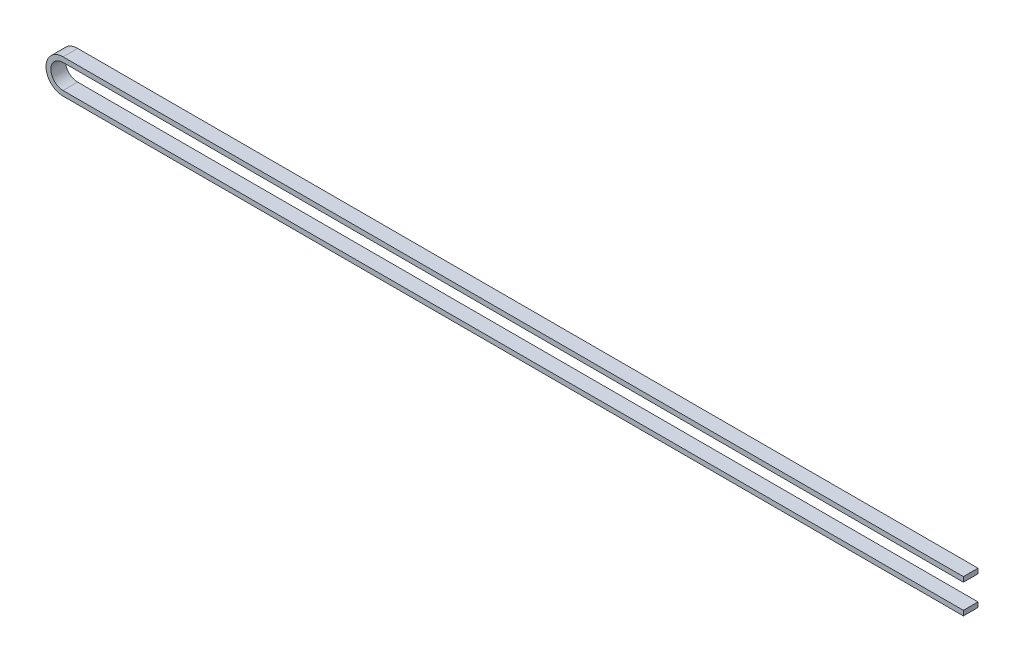
ISO-10303-21;
HEADER;
FILE_DESCRIPTION(('STEP AP214'),'2;1');
FILE_NAME('part.step','',(''),(''),'','','');
FILE_SCHEMA(('AUTOMOTIVE_DESIGN { 1 0 10303 214 1 1 1 1 }'));
ENDSEC;
DATA;
#1=APPLICATION_CONTEXT('core data for automotive mechanical design processes');
#2=APPLICATION_PROTOCOL_DEFINITION('international standard','automotive_design',2000,#1);
#3=PRODUCT_CONTEXT('',#1,'mechanical');
#4=PRODUCT('Part','Part','',(#3));
#5=PRODUCT_RELATED_PRODUCT_CATEGORY('part','',(#4));
#6=PRODUCT_DEFINITION_FORMATION('','',#4);
#7=PRODUCT_DEFINITION_CONTEXT('part definition',#1,'design');
#8=PRODUCT_DEFINITION('design','',#6,#7);
#9=PRODUCT_DEFINITION_SHAPE('','',#8);
#10=(LENGTH_UNIT() NAMED_UNIT(*) SI_UNIT(.MILLI.,.METRE.));
#11=(NAMED_UNIT(*) PLANE_ANGLE_UNIT() SI_UNIT($,.RADIAN.));
#12=(NAMED_UNIT(*) SI_UNIT($,.STERADIAN.) SOLID_ANGLE_UNIT());
#13=UNCERTAINTY_MEASURE_WITH_UNIT(LENGTH_MEASURE(1.E-05),#10,'distance_accuracy_value','');
#14=(GEOMETRIC_REPRESENTATION_CONTEXT(3) GLOBAL_UNCERTAINTY_ASSIGNED_CONTEXT((#13)) GLOBAL_UNIT_ASSIGNED_CONTEXT((#10,
#11,#12)) REPRESENTATION_CONTEXT('',''));
#15=CARTESIAN_POINT('',(0.,0.,0.));
#16=DIRECTION('',(0.,0.,1.));
#17=DIRECTION('',(1.,0.,0.));
#18=AXIS2_PLACEMENT_3D('',#15,#16,#17);
#19=CARTESIAN_POINT('',(0.,2.,0.));
#20=DIRECTION('',(0.,0.,-1.));
#21=DIRECTION('',(-1.,0.,0.));
#22=AXIS2_PLACEMENT_3D('',#19,#20,#21);
#23=PLANE('',#22);
#24=DIRECTION('',(1.,0.,0.));
#25=VECTOR('',#24,1.);
#26=CARTESIAN_POINT('',(0.,0.,0.));
#27=LINE('',#26,#25);
#28=CARTESIAN_POINT('',(0.,0.,0.));
#29=VERTEX_POINT('',#28);
#30=CARTESIAN_POINT('',(370.,0.,0.));
#31=VERTEX_POINT('',#30);
#32=EDGE_CURVE('E161',#29,#31,#27,.T.);
#33=ORIENTED_EDGE('',*,*,#32,.T.);
#34=DIRECTION('',(0.,-1.,0.));
#35=VECTOR('',#34,1.);
#36=CARTESIAN_POINT('',(370.,2.,0.));
#37=LINE('',#36,#35);
#38=CARTESIAN_POINT('',(370.,2.,0.));
#39=VERTEX_POINT('',#38);
#40=EDGE_CURVE('E11',#39,#31,#37,.T.);
#41=ORIENTED_EDGE('',*,*,#40,.F.);
#42=DIRECTION('',(1.,0.,0.));
#43=VECTOR('',#42,1.);
#44=CARTESIAN_POINT('',(0.,2.,0.));
#45=LINE('',#44,#43);
#46=CARTESIAN_POINT('',(0.,2.,0.));
#47=VERTEX_POINT('',#46);
#48=EDGE_CURVE('E80',#47,#39,#45,.T.);
#49=ORIENTED_EDGE('',*,*,#48,.F.);
#50=CARTESIAN_POINT('',(0.,7.,0.));
#51=DIRECTION('',(0.,0.,1.));
#52=DIRECTION('',(1.,0.,0.));
#53=AXIS2_PLACEMENT_3D('',#50,#51,#52);
#54=CIRCLE('',#53,5.);
#55=CARTESIAN_POINT('',(0.,12.,0.));
#56=VERTEX_POINT('',#55);
#57=EDGE_CURVE('E139',#47,#56,#54,.F.);
#58=ORIENTED_EDGE('',*,*,#57,.T.);
#59=DIRECTION('',(1.,0.,0.));
#60=VECTOR('',#59,1.);
#61=CARTESIAN_POINT('',(0.,12.,0.));
#62=LINE('',#61,#60);
#63=CARTESIAN_POINT('',(370.,12.,0.));
#64=VERTEX_POINT('',#63);
#65=EDGE_CURVE('E114',#56,#64,#62,.T.);
#66=ORIENTED_EDGE('',*,*,#65,.T.);
#67=DIRECTION('',(0.,1.,0.));
#68=VECTOR('',#67,1.);
#69=CARTESIAN_POINT('',(370.,0.,0.));
#70=LINE('',#69,#68);
#71=CARTESIAN_POINT('',(370.,14.,0.));
#72=VERTEX_POINT('',#71);
#73=EDGE_CURVE('E142',#64,#72,#70,.T.);
#74=ORIENTED_EDGE('',*,*,#73,.T.);
#75=DIRECTION('',(1.,0.,0.));
#76=VECTOR('',#75,1.);
#77=CARTESIAN_POINT('',(0.,14.,0.));
#78=LINE('',#77,#76);
#79=CARTESIAN_POINT('',(0.,14.,0.));
#80=VERTEX_POINT('',#79);
#81=EDGE_CURVE('E132',#80,#72,#78,.T.);
#82=ORIENTED_EDGE('',*,*,#81,.F.);
#83=CARTESIAN_POINT('',(0.,7.,0.));
#84=DIRECTION('',(0.,0.,1.));
#85=DIRECTION('',(1.,0.,0.));
#86=AXIS2_PLACEMENT_3D('',#83,#84,#85);
#87=CIRCLE('',#86,7.);
#88=EDGE_CURVE('E130',#29,#80,#87,.F.);
#89=ORIENTED_EDGE('',*,*,#88,.F.);
#90=EDGE_LOOP('',(#33,#41,#49,#58,#66,#74,#82,#89));
#91=FACE_BOUND('',#90,.T.);
#92=ADVANCED_FACE('F35',(#91),#23,.F.);
#93=CARTESIAN_POINT('',(370.,2.,0.));
#94=DIRECTION('',(-1.,0.,0.));
#95=DIRECTION('',(0.,0.,1.));
#96=AXIS2_PLACEMENT_3D('',#93,#94,#95);
#97=PLANE('',#96);
#98=DIRECTION('',(0.,0.,-1.));
#99=VECTOR('',#98,1.);
#100=CARTESIAN_POINT('',(370.,0.,0.));
#101=LINE('',#100,#99);
#102=CARTESIAN_POINT('',(370.,0.,-6.));
#103=VERTEX_POINT('',#102);
#104=EDGE_CURVE('E65',#31,#103,#101,.T.);
#105=ORIENTED_EDGE('',*,*,#104,.T.);
#106=DIRECTION('',(0.,-1.,0.));
#107=VECTOR('',#106,1.);
#108=CARTESIAN_POINT('',(370.,2.,-6.));
#109=LINE('',#108,#107);
#110=CARTESIAN_POINT('',(370.,2.,-6.));
#111=VERTEX_POINT('',#110);
#112=EDGE_CURVE('E43',#111,#103,#109,.T.);
#113=ORIENTED_EDGE('',*,*,#112,.F.);
#114=DIRECTION('',(0.,0.,-1.));
#115=VECTOR('',#114,1.);
#116=CARTESIAN_POINT('',(370.,2.,0.));
#117=LINE('',#116,#115);
#118=EDGE_CURVE('E156',#39,#111,#117,.T.);
#119=ORIENTED_EDGE('',*,*,#118,.F.);
#120=ORIENTED_EDGE('',*,*,#40,.T.);
#121=EDGE_LOOP('',(#105,#113,#119,#120));
#122=FACE_BOUND('',#121,.T.);
#123=ADVANCED_FACE('F181',(#122),#97,.F.);
#124=CARTESIAN_POINT('',(0.,2.,-6.));
#125=DIRECTION('',(0.,0.,1.));
#126=DIRECTION('',(1.,0.,0.));
#127=AXIS2_PLACEMENT_3D('',#124,#125,#126);
#128=PLANE('',#127);
#129=DIRECTION('',(-1.,0.,0.));
#130=VECTOR('',#129,1.);
#131=CARTESIAN_POINT('',(0.,0.,-6.));
#132=LINE('',#131,#130);
#133=CARTESIAN_POINT('',(0.,0.,-6.));
#134=VERTEX_POINT('',#133);
#135=EDGE_CURVE('E72',#103,#134,#132,.T.);
#136=ORIENTED_EDGE('',*,*,#135,.T.);
#137=CARTESIAN_POINT('',(0.,7.,-6.));
#138=DIRECTION('',(0.,0.,1.));
#139=DIRECTION('',(1.,0.,0.));
#140=AXIS2_PLACEMENT_3D('',#137,#138,#139);
#141=CIRCLE('',#140,7.);
#142=CARTESIAN_POINT('',(0.,14.,-6.));
#143=VERTEX_POINT('',#142);
#144=EDGE_CURVE('E119',#134,#143,#141,.F.);
#145=ORIENTED_EDGE('',*,*,#144,.T.);
#146=DIRECTION('',(1.,0.,0.));
#147=VECTOR('',#146,1.);
#148=CARTESIAN_POINT('',(0.,14.,-6.));
#149=LINE('',#148,#147);
#150=CARTESIAN_POINT('',(370.,14.,-6.));
#151=VERTEX_POINT('',#150);
#152=EDGE_CURVE('E136',#143,#151,#149,.T.);
#153=ORIENTED_EDGE('',*,*,#152,.T.);
#154=DIRECTION('',(0.,1.,0.));
#155=VECTOR('',#154,1.);
#156=CARTESIAN_POINT('',(370.,0.,-6.));
#157=LINE('',#156,#155);
#158=CARTESIAN_POINT('',(370.,12.,-6.));
#159=VERTEX_POINT('',#158);
#160=EDGE_CURVE('E126',#159,#151,#157,.T.);
#161=ORIENTED_EDGE('',*,*,#160,.F.);
#162=DIRECTION('',(1.,0.,0.));
#163=VECTOR('',#162,1.);
#164=CARTESIAN_POINT('',(0.,12.,-6.));
#165=LINE('',#164,#163);
#166=CARTESIAN_POINT('',(0.,12.,-6.));
#167=VERTEX_POINT('',#166);
#168=EDGE_CURVE('E112',#167,#159,#165,.T.);
#169=ORIENTED_EDGE('',*,*,#168,.F.);
#170=CARTESIAN_POINT('',(0.,7.,-6.));
#171=DIRECTION('',(0.,0.,1.));
#172=DIRECTION('',(1.,0.,0.));
#173=AXIS2_PLACEMENT_3D('',#170,#171,#172);
#174=CIRCLE('',#173,5.);
#175=CARTESIAN_POINT('',(0.,2.,-6.));
#176=VERTEX_POINT('',#175);
#177=EDGE_CURVE('E124',#176,#167,#174,.F.);
#178=ORIENTED_EDGE('',*,*,#177,.F.);
#179=DIRECTION('',(-1.,0.,0.));
#180=VECTOR('',#179,1.);
#181=CARTESIAN_POINT('',(0.,2.,-6.));
#182=LINE('',#181,#180);
#183=EDGE_CURVE('E51',#111,#176,#182,.T.);
#184=ORIENTED_EDGE('',*,*,#183,.F.);
#185=ORIENTED_EDGE('',*,*,#112,.T.);
#186=EDGE_LOOP('',(#136,#145,#153,#161,#169,#178,#184,#185));
#187=FACE_BOUND('',#186,.T.);
#188=ADVANCED_FACE('F123',(#187),#128,.F.);
#189=CARTESIAN_POINT('',(0.,2.,0.));
#190=DIRECTION('',(0.,-1.,0.));
#191=DIRECTION('',(0.,0.,-1.));
#192=AXIS2_PLACEMENT_3D('',#189,#190,#191);
#193=PLANE('',#192);
#194=DIRECTION('',(0.,0.,1.));
#195=VECTOR('',#194,1.);
#196=CARTESIAN_POINT('',(0.,2.,0.));
#197=LINE('',#196,#195);
#198=EDGE_CURVE('E129',#176,#47,#197,.T.);
#199=ORIENTED_EDGE('',*,*,#198,.T.);
#200=ORIENTED_EDGE('',*,*,#48,.T.);
#201=ORIENTED_EDGE('',*,*,#118,.T.);
#202=ORIENTED_EDGE('',*,*,#183,.T.);
#203=EDGE_LOOP('',(#199,#200,#201,#202));
#204=FACE_BOUND('',#203,.T.);
#205=ADVANCED_FACE('F188',(#204),#193,.F.);
#206=CARTESIAN_POINT('',(0.,0.,0.));
#207=DIRECTION('',(0.,-1.,0.));
#208=DIRECTION('',(0.,0.,-1.));
#209=AXIS2_PLACEMENT_3D('',#206,#207,#208);
#210=PLANE('',#209);
#211=DIRECTION('',(0.,0.,1.));
#212=VECTOR('',#211,1.);
#213=CARTESIAN_POINT('',(0.,0.,0.));
#214=LINE('',#213,#212);
#215=EDGE_CURVE('E150',#134,#29,#214,.T.);
#216=ORIENTED_EDGE('',*,*,#215,.F.);
#217=ORIENTED_EDGE('',*,*,#135,.F.);
#218=ORIENTED_EDGE('',*,*,#104,.F.);
#219=ORIENTED_EDGE('',*,*,#32,.F.);
#220=EDGE_LOOP('',(#216,#217,#218,#219));
#221=FACE_BOUND('',#220,.T.);
#222=ADVANCED_FACE('F166',(#221),#210,.T.);
#223=CARTESIAN_POINT('',(0.,7.,-6.));
#224=DIRECTION('',(0.,0.,1.));
#225=DIRECTION('',(1.,0.,0.));
#226=AXIS2_PLACEMENT_3D('',#223,#224,#225);
#227=CYLINDRICAL_SURFACE('',#226,7.);
#228=ORIENTED_EDGE('',*,*,#88,.T.);
#229=DIRECTION('',(0.,0.,1.));
#230=VECTOR('',#229,1.);
#231=CARTESIAN_POINT('',(0.,14.,-6.));
#232=LINE('',#231,#230);
#233=EDGE_CURVE('E147',#143,#80,#232,.T.);
#234=ORIENTED_EDGE('',*,*,#233,.F.);
#235=ORIENTED_EDGE('',*,*,#144,.F.);
#236=ORIENTED_EDGE('',*,*,#215,.T.);
#237=EDGE_LOOP('',(#228,#234,#235,#236));
#238=FACE_BOUND('',#237,.T.);
#239=ADVANCED_FACE('F171',(#238),#227,.T.);
#240=CARTESIAN_POINT('',(0.,14.,-6.));
#241=DIRECTION('',(0.,-1.,0.));
#242=DIRECTION('',(0.,0.,-1.));
#243=AXIS2_PLACEMENT_3D('',#240,#241,#242);
#244=PLANE('',#243);
#245=ORIENTED_EDGE('',*,*,#81,.T.);
#246=DIRECTION('',(0.,0.,1.));
#247=VECTOR('',#246,1.);
#248=CARTESIAN_POINT('',(370.,14.,-6.));
#249=LINE('',#248,#247);
#250=EDGE_CURVE('E151',#151,#72,#249,.T.);
#251=ORIENTED_EDGE('',*,*,#250,.F.);
#252=ORIENTED_EDGE('',*,*,#152,.F.);
#253=ORIENTED_EDGE('',*,*,#233,.T.);
#254=EDGE_LOOP('',(#245,#251,#252,#253));
#255=FACE_BOUND('',#254,.T.);
#256=ADVANCED_FACE('F175',(#255),#244,.F.);
#257=CARTESIAN_POINT('',(370.,0.,-6.));
#258=DIRECTION('',(1.,0.,0.));
#259=DIRECTION('',(0.,0.,-1.));
#260=AXIS2_PLACEMENT_3D('',#257,#258,#259);
#261=PLANE('',#260);
#262=ORIENTED_EDGE('',*,*,#73,.F.);
#263=DIRECTION('',(0.,0.,1.));
#264=VECTOR('',#263,1.);
#265=CARTESIAN_POINT('',(370.,12.,-6.));
#266=LINE('',#265,#264);
#267=EDGE_CURVE('E118',#159,#64,#266,.T.);
#268=ORIENTED_EDGE('',*,*,#267,.F.);
#269=ORIENTED_EDGE('',*,*,#160,.T.);
#270=ORIENTED_EDGE('',*,*,#250,.T.);
#271=EDGE_LOOP('',(#262,#268,#269,#270));
#272=FACE_BOUND('',#271,.T.);
#273=ADVANCED_FACE('F179',(#272),#261,.T.);
#274=CARTESIAN_POINT('',(0.,12.,-6.));
#275=DIRECTION('',(0.,-1.,0.));
#276=DIRECTION('',(0.,0.,-1.));
#277=AXIS2_PLACEMENT_3D('',#274,#275,#276);
#278=PLANE('',#277);
#279=ORIENTED_EDGE('',*,*,#65,.F.);
#280=DIRECTION('',(0.,0.,1.));
#281=VECTOR('',#280,1.);
#282=CARTESIAN_POINT('',(0.,12.,-6.));
#283=LINE('',#282,#281);
#284=EDGE_CURVE('E109',#167,#56,#283,.T.);
#285=ORIENTED_EDGE('',*,*,#284,.F.);
#286=ORIENTED_EDGE('',*,*,#168,.T.);
#287=ORIENTED_EDGE('',*,*,#267,.T.);
#288=EDGE_LOOP('',(#279,#285,#286,#287));
#289=FACE_BOUND('',#288,.T.);
#290=ADVANCED_FACE('F111',(#289),#278,.T.);
#291=CARTESIAN_POINT('',(0.,7.,-6.));
#292=DIRECTION('',(0.,0.,1.));
#293=DIRECTION('',(1.,0.,0.));
#294=AXIS2_PLACEMENT_3D('',#291,#292,#293);
#295=CYLINDRICAL_SURFACE('',#294,5.);
#296=ORIENTED_EDGE('',*,*,#57,.F.);
#297=ORIENTED_EDGE('',*,*,#198,.F.);
#298=ORIENTED_EDGE('',*,*,#177,.T.);
#299=ORIENTED_EDGE('',*,*,#284,.T.);
#300=EDGE_LOOP('',(#296,#297,#298,#299));
#301=FACE_BOUND('',#300,.T.);
#302=ADVANCED_FACE('F128',(#301),#295,.F.);
#303=CLOSED_SHELL('',(#92,#123,#188,#205,#222,#239,#256,#273,#290,#302));
#304=MANIFOLD_SOLID_BREP('B2',#303);
#305=ADVANCED_BREP_SHAPE_REPRESENTATION('',(#18,#304),#14);
#306=SHAPE_DEFINITION_REPRESENTATION(#9,#305);
ENDSEC;
END-ISO-10303-21;
